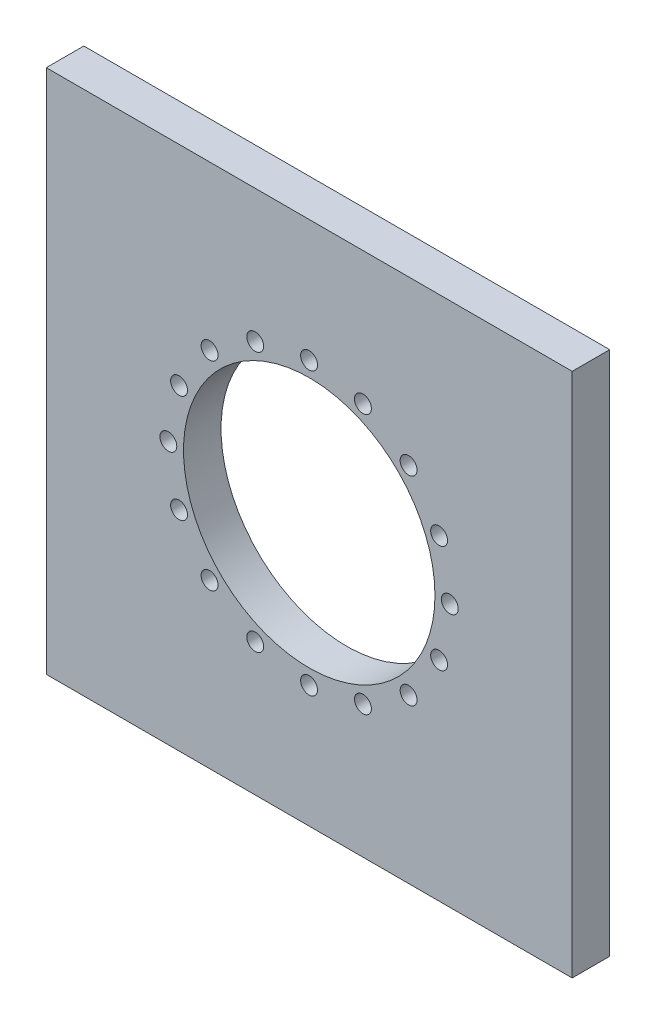
ISO-10303-21;
HEADER;
FILE_DESCRIPTION(('STEP AP214'),'2;1');
FILE_NAME('part.step','',(''),(''),'','','');
FILE_SCHEMA(('AUTOMOTIVE_DESIGN { 1 0 10303 214 1 1 1 1 }'));
ENDSEC;
DATA;
#1=APPLICATION_CONTEXT('core data for automotive mechanical design processes');
#2=APPLICATION_PROTOCOL_DEFINITION('international standard','automotive_design',2000,#1);
#3=PRODUCT_CONTEXT('',#1,'mechanical');
#4=PRODUCT('Part','Part','',(#3));
#5=PRODUCT_RELATED_PRODUCT_CATEGORY('part','',(#4));
#6=PRODUCT_DEFINITION_FORMATION('','',#4);
#7=PRODUCT_DEFINITION_CONTEXT('part definition',#1,'design');
#8=PRODUCT_DEFINITION('design','',#6,#7);
#9=PRODUCT_DEFINITION_SHAPE('','',#8);
#10=(LENGTH_UNIT() NAMED_UNIT(*) SI_UNIT(.MILLI.,.METRE.));
#11=(NAMED_UNIT(*) PLANE_ANGLE_UNIT() SI_UNIT($,.RADIAN.));
#12=(NAMED_UNIT(*) SI_UNIT($,.STERADIAN.) SOLID_ANGLE_UNIT());
#13=UNCERTAINTY_MEASURE_WITH_UNIT(LENGTH_MEASURE(1.E-05),#10,'distance_accuracy_value','');
#14=(GEOMETRIC_REPRESENTATION_CONTEXT(3) GLOBAL_UNCERTAINTY_ASSIGNED_CONTEXT((#13)) GLOBAL_UNIT_ASSIGNED_CONTEXT((#10,
#11,#12)) REPRESENTATION_CONTEXT('',''));
#15=CARTESIAN_POINT('',(0.,0.,0.));
#16=DIRECTION('',(0.,0.,1.));
#17=DIRECTION('',(1.,0.,0.));
#18=AXIS2_PLACEMENT_3D('',#15,#16,#17);
#19=CARTESIAN_POINT('',(-191.921565510779,-70.,10.));
#20=DIRECTION('',(-1.,0.,0.));
#21=DIRECTION('',(0.,0.,1.));
#22=AXIS2_PLACEMENT_3D('',#19,#20,#21);
#23=PLANE('',#22);
#24=DIRECTION('',(0.,1.,0.));
#25=VECTOR('',#24,1.);
#26=CARTESIAN_POINT('',(-191.921565510779,-70.,0.));
#27=LINE('',#26,#25);
#28=CARTESIAN_POINT('',(-191.921565510779,-70.,0.));
#29=VERTEX_POINT('',#28);
#30=CARTESIAN_POINT('',(-191.921565510779,70.,0.));
#31=VERTEX_POINT('',#30);
#32=EDGE_CURVE('E118',#29,#31,#27,.T.);
#33=ORIENTED_EDGE('',*,*,#32,.F.);
#34=DIRECTION('',(0.,0.,-1.));
#35=VECTOR('',#34,1.);
#36=CARTESIAN_POINT('',(-191.921565510779,-70.,10.));
#37=LINE('',#36,#35);
#38=CARTESIAN_POINT('',(-191.921565510779,-70.,10.));
#39=VERTEX_POINT('',#38);
#40=EDGE_CURVE('E12',#39,#29,#37,.T.);
#41=ORIENTED_EDGE('',*,*,#40,.F.);
#42=DIRECTION('',(0.,1.,0.));
#43=VECTOR('',#42,1.);
#44=CARTESIAN_POINT('',(-191.921565510779,-70.,10.));
#45=LINE('',#44,#43);
#46=CARTESIAN_POINT('',(-191.921565510779,70.,10.));
#47=VERTEX_POINT('',#46);
#48=EDGE_CURVE('E110',#39,#47,#45,.T.);
#49=ORIENTED_EDGE('',*,*,#48,.T.);
#50=DIRECTION('',(0.,0.,-1.));
#51=VECTOR('',#50,1.);
#52=CARTESIAN_POINT('',(-191.921565510779,70.,10.));
#53=LINE('',#52,#51);
#54=EDGE_CURVE('E49',#47,#31,#53,.T.);
#55=ORIENTED_EDGE('',*,*,#54,.T.);
#56=EDGE_LOOP('',(#33,#41,#49,#55));
#57=FACE_BOUND('',#56,.T.);
#58=ADVANCED_FACE('F46',(#57),#23,.T.);
#59=CARTESIAN_POINT('',(-191.921565510779,-70.,10.));
#60=DIRECTION('',(0.,1.,0.));
#61=DIRECTION('',(0.,0.,1.));
#62=AXIS2_PLACEMENT_3D('',#59,#60,#61);
#63=PLANE('',#62);
#64=DIRECTION('',(1.,0.,0.));
#65=VECTOR('',#64,1.);
#66=CARTESIAN_POINT('',(-191.921565510779,-70.,0.));
#67=LINE('',#66,#65);
#68=CARTESIAN_POINT('',(-51.7905653631904,-70.,0.));
#69=VERTEX_POINT('',#68);
#70=EDGE_CURVE('E80',#29,#69,#67,.T.);
#71=ORIENTED_EDGE('',*,*,#70,.T.);
#72=DIRECTION('',(0.,0.,-1.));
#73=VECTOR('',#72,1.);
#74=CARTESIAN_POINT('',(-51.7905653631904,-70.,10.));
#75=LINE('',#74,#73);
#76=CARTESIAN_POINT('',(-51.7905653631904,-70.,10.));
#77=VERTEX_POINT('',#76);
#78=EDGE_CURVE('E56',#77,#69,#75,.T.);
#79=ORIENTED_EDGE('',*,*,#78,.F.);
#80=DIRECTION('',(1.,0.,0.));
#81=VECTOR('',#80,1.);
#82=CARTESIAN_POINT('',(-191.921565510779,-70.,10.));
#83=LINE('',#82,#81);
#84=EDGE_CURVE('E97',#39,#77,#83,.T.);
#85=ORIENTED_EDGE('',*,*,#84,.F.);
#86=ORIENTED_EDGE('',*,*,#40,.T.);
#87=EDGE_LOOP('',(#71,#79,#85,#86));
#88=FACE_BOUND('',#87,.T.);
#89=ADVANCED_FACE('F135',(#88),#63,.F.);
#90=CARTESIAN_POINT('',(-51.7905653631904,-70.,10.));
#91=DIRECTION('',(-1.,0.,0.));
#92=DIRECTION('',(0.,0.,1.));
#93=AXIS2_PLACEMENT_3D('',#90,#91,#92);
#94=PLANE('',#93);
#95=DIRECTION('',(0.,1.,0.));
#96=VECTOR('',#95,1.);
#97=CARTESIAN_POINT('',(-51.7905653631904,-70.,0.));
#98=LINE('',#97,#96);
#99=CARTESIAN_POINT('',(-51.7905653631904,70.,0.));
#100=VERTEX_POINT('',#99);
#101=EDGE_CURVE('E105',#69,#100,#98,.T.);
#102=ORIENTED_EDGE('',*,*,#101,.T.);
#103=DIRECTION('',(0.,0.,-1.));
#104=VECTOR('',#103,1.);
#105=CARTESIAN_POINT('',(-51.7905653631904,70.,10.));
#106=LINE('',#105,#104);
#107=CARTESIAN_POINT('',(-51.7905653631904,70.,10.));
#108=VERTEX_POINT('',#107);
#109=EDGE_CURVE('E102',#108,#100,#106,.T.);
#110=ORIENTED_EDGE('',*,*,#109,.F.);
#111=DIRECTION('',(0.,1.,0.));
#112=VECTOR('',#111,1.);
#113=CARTESIAN_POINT('',(-51.7905653631904,-70.,10.));
#114=LINE('',#113,#112);
#115=EDGE_CURVE('E92',#77,#108,#114,.T.);
#116=ORIENTED_EDGE('',*,*,#115,.F.);
#117=ORIENTED_EDGE('',*,*,#78,.T.);
#118=EDGE_LOOP('',(#102,#110,#116,#117));
#119=FACE_BOUND('',#118,.T.);
#120=ADVANCED_FACE('F103',(#119),#94,.F.);
#121=CARTESIAN_POINT('',(-191.921565510779,70.,10.));
#122=DIRECTION('',(0.,1.,0.));
#123=DIRECTION('',(0.,0.,1.));
#124=AXIS2_PLACEMENT_3D('',#121,#122,#123);
#125=PLANE('',#124);
#126=DIRECTION('',(1.,0.,0.));
#127=VECTOR('',#126,1.);
#128=CARTESIAN_POINT('',(-191.921565510779,70.,0.));
#129=LINE('',#128,#127);
#130=EDGE_CURVE('E122',#31,#100,#129,.T.);
#131=ORIENTED_EDGE('',*,*,#130,.F.);
#132=ORIENTED_EDGE('',*,*,#54,.F.);
#133=DIRECTION('',(1.,0.,0.));
#134=VECTOR('',#133,1.);
#135=CARTESIAN_POINT('',(-191.921565510779,70.,10.));
#136=LINE('',#135,#134);
#137=EDGE_CURVE('E96',#47,#108,#136,.T.);
#138=ORIENTED_EDGE('',*,*,#137,.T.);
#139=ORIENTED_EDGE('',*,*,#109,.T.);
#140=EDGE_LOOP('',(#131,#132,#138,#139));
#141=FACE_BOUND('',#140,.T.);
#142=ADVANCED_FACE('F108',(#141),#125,.T.);
#143=CARTESIAN_POINT('',(0.,0.,10.));
#144=DIRECTION('',(0.,0.,-1.));
#145=DIRECTION('',(-1.,0.,0.));
#146=AXIS2_PLACEMENT_3D('',#143,#144,#145);
#147=PLANE('',#146);
#148=CARTESIAN_POINT('',(-95.3827887099841,26.5165042944958,10.));
#149=DIRECTION('',(0.,0.,1.));
#150=DIRECTION('',(1.,0.,0.));
#151=AXIS2_PLACEMENT_3D('',#148,#149,#150);
#152=CIRCLE('',#151,2.25000000000006);
#153=CARTESIAN_POINT('',(-93.132788709984,26.5165042944958,10.));
#154=VERTEX_POINT('',#153);
#155=EDGE_CURVE('E298',#154,#154,#152,.T.);
#156=ORIENTED_EDGE('',*,*,#155,.F.);
#157=EDGE_LOOP('',(#156));
#158=FACE_BOUND('',#157,.T.);
#159=CARTESIAN_POINT('',(-87.2538105353063,14.3506287136913,10.));
#160=DIRECTION('',(0.,0.,1.));
#161=DIRECTION('',(1.,0.,0.));
#162=AXIS2_PLACEMENT_3D('',#159,#160,#161);
#163=CIRCLE('',#162,2.25000000000002);
#164=CARTESIAN_POINT('',(-85.0038105353063,14.3506287136913,10.));
#165=VERTEX_POINT('',#164);
#166=EDGE_CURVE('E306',#165,#165,#163,.T.);
#167=ORIENTED_EDGE('',*,*,#166,.F.);
#168=EDGE_LOOP('',(#167));
#169=FACE_BOUND('',#168,.T.);
#170=CARTESIAN_POINT('',(-84.3992930044792,0.,10.));
#171=DIRECTION('',(0.,0.,1.));
#172=DIRECTION('',(1.,0.,0.));
#173=AXIS2_PLACEMENT_3D('',#170,#171,#172);
#174=CIRCLE('',#173,2.25);
#175=CARTESIAN_POINT('',(-82.1492930044792,0.,10.));
#176=VERTEX_POINT('',#175);
#177=EDGE_CURVE('E314',#176,#176,#174,.T.);
#178=ORIENTED_EDGE('',*,*,#177,.F.);
#179=EDGE_LOOP('',(#178));
#180=FACE_BOUND('',#179,.T.);
#181=CARTESIAN_POINT('',(-87.2538105353063,-14.3506287136901,10.));
#182=DIRECTION('',(0.,0.,1.));
#183=DIRECTION('',(1.,0.,0.));
#184=AXIS2_PLACEMENT_3D('',#181,#182,#183);
#185=CIRCLE('',#184,2.24999999999997);
#186=CARTESIAN_POINT('',(-85.0038105353064,-14.3506287136901,10.));
#187=VERTEX_POINT('',#186);
#188=EDGE_CURVE('E322',#187,#187,#185,.T.);
#189=ORIENTED_EDGE('',*,*,#188,.F.);
#190=EDGE_LOOP('',(#189));
#191=FACE_BOUND('',#190,.T.);
#192=CARTESIAN_POINT('',(-95.3827887099839,-26.5165042944946,10.));
#193=DIRECTION('',(0.,0.,1.));
#194=DIRECTION('',(1.,0.,0.));
#195=AXIS2_PLACEMENT_3D('',#192,#193,#194);
#196=CIRCLE('',#195,2.24999999999996);
#197=CARTESIAN_POINT('',(-93.132788709984,-26.5165042944946,10.));
#198=VERTEX_POINT('',#197);
#199=EDGE_CURVE('E330',#198,#198,#196,.T.);
#200=ORIENTED_EDGE('',*,*,#199,.F.);
#201=EDGE_LOOP('',(#200));
#202=FACE_BOUND('',#201,.T.);
#203=CARTESIAN_POINT('',(-107.548664290788,-34.6454824691723,10.));
#204=DIRECTION('',(0.,0.,1.));
#205=DIRECTION('',(1.,0.,0.));
#206=AXIS2_PLACEMENT_3D('',#203,#204,#205);
#207=CIRCLE('',#206,2.24999999999989);
#208=CARTESIAN_POINT('',(-105.298664290789,-34.6454824691723,10.));
#209=VERTEX_POINT('',#208);
#210=EDGE_CURVE('E338',#209,#209,#207,.T.);
#211=ORIENTED_EDGE('',*,*,#210,.F.);
#212=EDGE_LOOP('',(#211));
#213=FACE_BOUND('',#212,.T.);
#214=CARTESIAN_POINT('',(-121.899293004479,-37.4999999999989,10.));
#215=DIRECTION('',(0.,0.,1.));
#216=DIRECTION('',(1.,0.,0.));
#217=AXIS2_PLACEMENT_3D('',#214,#215,#216);
#218=CIRCLE('',#217,2.25);
#219=CARTESIAN_POINT('',(-119.649293004479,-37.4999999999989,10.));
#220=VERTEX_POINT('',#219);
#221=EDGE_CURVE('E346',#220,#220,#218,.T.);
#222=ORIENTED_EDGE('',*,*,#221,.F.);
#223=EDGE_LOOP('',(#222));
#224=FACE_BOUND('',#223,.T.);
#225=CARTESIAN_POINT('',(-136.24992171817,-34.6454824691723,10.));
#226=DIRECTION('',(0.,0.,1.));
#227=DIRECTION('',(1.,0.,0.));
#228=AXIS2_PLACEMENT_3D('',#225,#226,#227);
#229=CIRCLE('',#228,2.25000000000003);
#230=CARTESIAN_POINT('',(-133.99992171817,-34.6454824691723,10.));
#231=VERTEX_POINT('',#230);
#232=EDGE_CURVE('E236',#231,#231,#229,.T.);
#233=ORIENTED_EDGE('',*,*,#232,.F.);
#234=EDGE_LOOP('',(#233));
#235=FACE_BOUND('',#234,.T.);
#236=CARTESIAN_POINT('',(-148.415797298974,-26.5165042944946,10.));
#237=DIRECTION('',(0.,0.,1.));
#238=DIRECTION('',(1.,0.,0.));
#239=AXIS2_PLACEMENT_3D('',#236,#237,#238);
#240=CIRCLE('',#239,2.25000000000003);
#241=CARTESIAN_POINT('',(-146.165797298974,-26.5165042944946,10.));
#242=VERTEX_POINT('',#241);
#243=EDGE_CURVE('E230',#242,#242,#240,.T.);
#244=ORIENTED_EDGE('',*,*,#243,.F.);
#245=EDGE_LOOP('',(#244));
#246=FACE_BOUND('',#245,.T.);
#247=CARTESIAN_POINT('',(-156.544775473652,-14.3506287136901,10.));
#248=DIRECTION('',(0.,0.,1.));
#249=DIRECTION('',(1.,0.,0.));
#250=AXIS2_PLACEMENT_3D('',#247,#248,#249);
#251=CIRCLE('',#250,2.25000000000003);
#252=CARTESIAN_POINT('',(-154.294775473652,-14.3506287136901,10.));
#253=VERTEX_POINT('',#252);
#254=EDGE_CURVE('E249',#253,#253,#251,.T.);
#255=ORIENTED_EDGE('',*,*,#254,.F.);
#256=EDGE_LOOP('',(#255));
#257=FACE_BOUND('',#256,.T.);
#258=CARTESIAN_POINT('',(-159.399293004478,5.969E-13,10.));
#259=DIRECTION('',(0.,0.,1.));
#260=DIRECTION('',(1.,0.,0.));
#261=AXIS2_PLACEMENT_3D('',#258,#259,#260);
#262=CIRCLE('',#261,2.25);
#263=CARTESIAN_POINT('',(-157.149293004478,5.969E-13,10.));
#264=VERTEX_POINT('',#263);
#265=EDGE_CURVE('E257',#264,#264,#262,.T.);
#266=ORIENTED_EDGE('',*,*,#265,.F.);
#267=EDGE_LOOP('',(#266));
#268=FACE_BOUND('',#267,.T.);
#269=CARTESIAN_POINT('',(-156.544775473652,14.3506287136912,10.));
#270=DIRECTION('',(0.,0.,1.));
#271=DIRECTION('',(1.,0.,0.));
#272=AXIS2_PLACEMENT_3D('',#269,#270,#271);
#273=CIRCLE('',#272,2.25000000000003);
#274=CARTESIAN_POINT('',(-154.294775473652,14.3506287136912,10.));
#275=VERTEX_POINT('',#274);
#276=EDGE_CURVE('E265',#275,#275,#273,.T.);
#277=ORIENTED_EDGE('',*,*,#276,.F.);
#278=EDGE_LOOP('',(#277));
#279=FACE_BOUND('',#278,.T.);
#280=CARTESIAN_POINT('',(-148.415797298974,26.5165042944957,10.));
#281=DIRECTION('',(0.,0.,1.));
#282=DIRECTION('',(1.,0.,0.));
#283=AXIS2_PLACEMENT_3D('',#280,#281,#282);
#284=CIRCLE('',#283,2.24999999999995);
#285=CARTESIAN_POINT('',(-146.165797298974,26.5165042944957,10.));
#286=VERTEX_POINT('',#285);
#287=EDGE_CURVE('E273',#286,#286,#284,.T.);
#288=ORIENTED_EDGE('',*,*,#287,.F.);
#289=EDGE_LOOP('',(#288));
#290=FACE_BOUND('',#289,.T.);
#291=CARTESIAN_POINT('',(-136.24992171817,34.6454824691734,10.));
#292=DIRECTION('',(0.,0.,1.));
#293=DIRECTION('',(1.,0.,0.));
#294=AXIS2_PLACEMENT_3D('',#291,#292,#293);
#295=CIRCLE('',#294,2.25);
#296=CARTESIAN_POINT('',(-133.99992171817,34.6454824691734,10.));
#297=VERTEX_POINT('',#296);
#298=EDGE_CURVE('E281',#297,#297,#295,.T.);
#299=ORIENTED_EDGE('',*,*,#298,.F.);
#300=EDGE_LOOP('',(#299));
#301=FACE_BOUND('',#300,.T.);
#302=CARTESIAN_POINT('',(-121.899293004479,37.5,10.));
#303=DIRECTION('',(0.,0.,1.));
#304=DIRECTION('',(1.,0.,0.));
#305=AXIS2_PLACEMENT_3D('',#302,#303,#304);
#306=CIRCLE('',#305,2.25);
#307=CARTESIAN_POINT('',(-119.649293004479,37.5,10.));
#308=VERTEX_POINT('',#307);
#309=EDGE_CURVE('E289',#308,#308,#306,.T.);
#310=ORIENTED_EDGE('',*,*,#309,.F.);
#311=EDGE_LOOP('',(#310));
#312=FACE_BOUND('',#311,.T.);
#313=CARTESIAN_POINT('',(-107.548664290788,34.6454824691734,10.));
#314=DIRECTION('',(0.,0.,1.));
#315=DIRECTION('',(1.,0.,0.));
#316=AXIS2_PLACEMENT_3D('',#313,#314,#315);
#317=CIRCLE('',#316,2.25000000000007);
#318=CARTESIAN_POINT('',(-105.298664290788,34.6454824691734,10.));
#319=VERTEX_POINT('',#318);
#320=EDGE_CURVE('E353',#319,#319,#317,.T.);
#321=ORIENTED_EDGE('',*,*,#320,.F.);
#322=EDGE_LOOP('',(#321));
#323=FACE_BOUND('',#322,.T.);
#324=CARTESIAN_POINT('',(-121.856065436985,0.,10.));
#325=DIRECTION('',(0.,0.,1.));
#326=DIRECTION('',(1.,0.,0.));
#327=AXIS2_PLACEMENT_3D('',#324,#325,#326);
#328=CIRCLE('',#327,33.4999994968227);
#329=CARTESIAN_POINT('',(-88.356065940162,0.,10.));
#330=VERTEX_POINT('',#329);
#331=EDGE_CURVE('E123',#330,#330,#328,.T.);
#332=ORIENTED_EDGE('',*,*,#331,.F.);
#333=EDGE_LOOP('',(#332));
#334=FACE_BOUND('',#333,.T.);
#335=ORIENTED_EDGE('',*,*,#48,.F.);
#336=ORIENTED_EDGE('',*,*,#84,.T.);
#337=ORIENTED_EDGE('',*,*,#115,.T.);
#338=ORIENTED_EDGE('',*,*,#137,.F.);
#339=EDGE_LOOP('',(#335,#336,#337,#338));
#340=FACE_BOUND('',#339,.T.);
#341=ADVANCED_FACE('F95',(#158,#169,#180,#191,#202,#213,#224,#235,#246,#257,#268,#279,#290,#301,
#312,#323,#334,#340),#147,.F.);
#342=CARTESIAN_POINT('',(0.,0.,0.));
#343=DIRECTION('',(0.,0.,-1.));
#344=DIRECTION('',(-1.,0.,0.));
#345=AXIS2_PLACEMENT_3D('',#342,#343,#344);
#346=PLANE('',#345);
#347=CARTESIAN_POINT('',(-95.3827887099841,26.5165042944958,0.));
#348=DIRECTION('',(0.,0.,1.));
#349=DIRECTION('',(1.,0.,0.));
#350=AXIS2_PLACEMENT_3D('',#347,#348,#349);
#351=CIRCLE('',#350,2.25000000000006);
#352=CARTESIAN_POINT('',(-93.132788709984,26.5165042944958,0.));
#353=VERTEX_POINT('',#352);
#354=EDGE_CURVE('E293',#353,#353,#351,.T.);
#355=ORIENTED_EDGE('',*,*,#354,.T.);
#356=EDGE_LOOP('',(#355));
#357=FACE_BOUND('',#356,.T.);
#358=CARTESIAN_POINT('',(-87.2538105353063,14.3506287136913,0.));
#359=DIRECTION('',(0.,0.,1.));
#360=DIRECTION('',(1.,0.,0.));
#361=AXIS2_PLACEMENT_3D('',#358,#359,#360);
#362=CIRCLE('',#361,2.25000000000002);
#363=CARTESIAN_POINT('',(-85.0038105353063,14.3506287136913,0.));
#364=VERTEX_POINT('',#363);
#365=EDGE_CURVE('E302',#364,#364,#362,.T.);
#366=ORIENTED_EDGE('',*,*,#365,.T.);
#367=EDGE_LOOP('',(#366));
#368=FACE_BOUND('',#367,.T.);
#369=CARTESIAN_POINT('',(-84.3992930044792,0.,0.));
#370=DIRECTION('',(0.,0.,1.));
#371=DIRECTION('',(1.,0.,0.));
#372=AXIS2_PLACEMENT_3D('',#369,#370,#371);
#373=CIRCLE('',#372,2.25);
#374=CARTESIAN_POINT('',(-82.1492930044792,0.,0.));
#375=VERTEX_POINT('',#374);
#376=EDGE_CURVE('E310',#375,#375,#373,.T.);
#377=ORIENTED_EDGE('',*,*,#376,.T.);
#378=EDGE_LOOP('',(#377));
#379=FACE_BOUND('',#378,.T.);
#380=CARTESIAN_POINT('',(-87.2538105353063,-14.3506287136901,0.));
#381=DIRECTION('',(0.,0.,1.));
#382=DIRECTION('',(1.,0.,0.));
#383=AXIS2_PLACEMENT_3D('',#380,#381,#382);
#384=CIRCLE('',#383,2.24999999999997);
#385=CARTESIAN_POINT('',(-85.0038105353064,-14.3506287136901,0.));
#386=VERTEX_POINT('',#385);
#387=EDGE_CURVE('E318',#386,#386,#384,.T.);
#388=ORIENTED_EDGE('',*,*,#387,.T.);
#389=EDGE_LOOP('',(#388));
#390=FACE_BOUND('',#389,.T.);
#391=CARTESIAN_POINT('',(-95.3827887099839,-26.5165042944946,0.));
#392=DIRECTION('',(0.,0.,1.));
#393=DIRECTION('',(1.,0.,0.));
#394=AXIS2_PLACEMENT_3D('',#391,#392,#393);
#395=CIRCLE('',#394,2.24999999999996);
#396=CARTESIAN_POINT('',(-93.132788709984,-26.5165042944946,0.));
#397=VERTEX_POINT('',#396);
#398=EDGE_CURVE('E326',#397,#397,#395,.T.);
#399=ORIENTED_EDGE('',*,*,#398,.T.);
#400=EDGE_LOOP('',(#399));
#401=FACE_BOUND('',#400,.T.);
#402=CARTESIAN_POINT('',(-107.548664290788,-34.6454824691723,0.));
#403=DIRECTION('',(0.,0.,1.));
#404=DIRECTION('',(1.,0.,0.));
#405=AXIS2_PLACEMENT_3D('',#402,#403,#404);
#406=CIRCLE('',#405,2.24999999999989);
#407=CARTESIAN_POINT('',(-105.298664290789,-34.6454824691723,0.));
#408=VERTEX_POINT('',#407);
#409=EDGE_CURVE('E334',#408,#408,#406,.T.);
#410=ORIENTED_EDGE('',*,*,#409,.T.);
#411=EDGE_LOOP('',(#410));
#412=FACE_BOUND('',#411,.T.);
#413=CARTESIAN_POINT('',(-121.899293004479,-37.4999999999989,0.));
#414=DIRECTION('',(0.,0.,1.));
#415=DIRECTION('',(1.,0.,0.));
#416=AXIS2_PLACEMENT_3D('',#413,#414,#415);
#417=CIRCLE('',#416,2.25);
#418=CARTESIAN_POINT('',(-119.649293004479,-37.4999999999989,0.));
#419=VERTEX_POINT('',#418);
#420=EDGE_CURVE('E342',#419,#419,#417,.T.);
#421=ORIENTED_EDGE('',*,*,#420,.T.);
#422=EDGE_LOOP('',(#421));
#423=FACE_BOUND('',#422,.T.);
#424=CARTESIAN_POINT('',(-136.24992171817,-34.6454824691723,0.));
#425=DIRECTION('',(0.,0.,1.));
#426=DIRECTION('',(1.,0.,0.));
#427=AXIS2_PLACEMENT_3D('',#424,#425,#426);
#428=CIRCLE('',#427,2.25000000000003);
#429=CARTESIAN_POINT('',(-133.99992171817,-34.6454824691723,0.));
#430=VERTEX_POINT('',#429);
#431=EDGE_CURVE('E241',#430,#430,#428,.T.);
#432=ORIENTED_EDGE('',*,*,#431,.T.);
#433=EDGE_LOOP('',(#432));
#434=FACE_BOUND('',#433,.T.);
#435=CARTESIAN_POINT('',(-148.415797298974,-26.5165042944946,0.));
#436=DIRECTION('',(0.,0.,1.));
#437=DIRECTION('',(1.,0.,0.));
#438=AXIS2_PLACEMENT_3D('',#435,#436,#437);
#439=CIRCLE('',#438,2.25000000000003);
#440=CARTESIAN_POINT('',(-146.165797298974,-26.5165042944946,0.));
#441=VERTEX_POINT('',#440);
#442=EDGE_CURVE('E233',#441,#441,#439,.T.);
#443=ORIENTED_EDGE('',*,*,#442,.T.);
#444=EDGE_LOOP('',(#443));
#445=FACE_BOUND('',#444,.T.);
#446=CARTESIAN_POINT('',(-156.544775473652,-14.3506287136901,0.));
#447=DIRECTION('',(0.,0.,1.));
#448=DIRECTION('',(1.,0.,0.));
#449=AXIS2_PLACEMENT_3D('',#446,#447,#448);
#450=CIRCLE('',#449,2.25000000000003);
#451=CARTESIAN_POINT('',(-154.294775473652,-14.3506287136901,0.));
#452=VERTEX_POINT('',#451);
#453=EDGE_CURVE('E243',#452,#452,#450,.T.);
#454=ORIENTED_EDGE('',*,*,#453,.T.);
#455=EDGE_LOOP('',(#454));
#456=FACE_BOUND('',#455,.T.);
#457=CARTESIAN_POINT('',(-159.399293004478,5.969E-13,0.));
#458=DIRECTION('',(0.,0.,1.));
#459=DIRECTION('',(1.,0.,0.));
#460=AXIS2_PLACEMENT_3D('',#457,#458,#459);
#461=CIRCLE('',#460,2.25);
#462=CARTESIAN_POINT('',(-157.149293004478,5.969E-13,0.));
#463=VERTEX_POINT('',#462);
#464=EDGE_CURVE('E253',#463,#463,#461,.T.);
#465=ORIENTED_EDGE('',*,*,#464,.T.);
#466=EDGE_LOOP('',(#465));
#467=FACE_BOUND('',#466,.T.);
#468=CARTESIAN_POINT('',(-156.544775473652,14.3506287136912,0.));
#469=DIRECTION('',(0.,0.,1.));
#470=DIRECTION('',(1.,0.,0.));
#471=AXIS2_PLACEMENT_3D('',#468,#469,#470);
#472=CIRCLE('',#471,2.25000000000003);
#473=CARTESIAN_POINT('',(-154.294775473652,14.3506287136912,0.));
#474=VERTEX_POINT('',#473);
#475=EDGE_CURVE('E261',#474,#474,#472,.T.);
#476=ORIENTED_EDGE('',*,*,#475,.T.);
#477=EDGE_LOOP('',(#476));
#478=FACE_BOUND('',#477,.T.);
#479=CARTESIAN_POINT('',(-148.415797298974,26.5165042944957,0.));
#480=DIRECTION('',(0.,0.,1.));
#481=DIRECTION('',(1.,0.,0.));
#482=AXIS2_PLACEMENT_3D('',#479,#480,#481);
#483=CIRCLE('',#482,2.24999999999995);
#484=CARTESIAN_POINT('',(-146.165797298974,26.5165042944957,0.));
#485=VERTEX_POINT('',#484);
#486=EDGE_CURVE('E269',#485,#485,#483,.T.);
#487=ORIENTED_EDGE('',*,*,#486,.T.);
#488=EDGE_LOOP('',(#487));
#489=FACE_BOUND('',#488,.T.);
#490=CARTESIAN_POINT('',(-136.24992171817,34.6454824691734,0.));
#491=DIRECTION('',(0.,0.,1.));
#492=DIRECTION('',(1.,0.,0.));
#493=AXIS2_PLACEMENT_3D('',#490,#491,#492);
#494=CIRCLE('',#493,2.25);
#495=CARTESIAN_POINT('',(-133.99992171817,34.6454824691734,0.));
#496=VERTEX_POINT('',#495);
#497=EDGE_CURVE('E277',#496,#496,#494,.T.);
#498=ORIENTED_EDGE('',*,*,#497,.T.);
#499=EDGE_LOOP('',(#498));
#500=FACE_BOUND('',#499,.T.);
#501=CARTESIAN_POINT('',(-121.899293004479,37.5,0.));
#502=DIRECTION('',(0.,0.,1.));
#503=DIRECTION('',(1.,0.,0.));
#504=AXIS2_PLACEMENT_3D('',#501,#502,#503);
#505=CIRCLE('',#504,2.25);
#506=CARTESIAN_POINT('',(-119.649293004479,37.5,0.));
#507=VERTEX_POINT('',#506);
#508=EDGE_CURVE('E285',#507,#507,#505,.T.);
#509=ORIENTED_EDGE('',*,*,#508,.T.);
#510=EDGE_LOOP('',(#509));
#511=FACE_BOUND('',#510,.T.);
#512=CARTESIAN_POINT('',(-107.548664290788,34.6454824691734,0.));
#513=DIRECTION('',(0.,0.,1.));
#514=DIRECTION('',(1.,0.,0.));
#515=AXIS2_PLACEMENT_3D('',#512,#513,#514);
#516=CIRCLE('',#515,2.25000000000007);
#517=CARTESIAN_POINT('',(-105.298664290788,34.6454824691734,0.));
#518=VERTEX_POINT('',#517);
#519=EDGE_CURVE('E297',#518,#518,#516,.T.);
#520=ORIENTED_EDGE('',*,*,#519,.T.);
#521=EDGE_LOOP('',(#520));
#522=FACE_BOUND('',#521,.T.);
#523=CARTESIAN_POINT('',(-121.856065436985,0.,0.));
#524=DIRECTION('',(0.,0.,1.));
#525=DIRECTION('',(1.,0.,0.));
#526=AXIS2_PLACEMENT_3D('',#523,#524,#525);
#527=CIRCLE('',#526,33.4999994968227);
#528=CARTESIAN_POINT('',(-88.356065940162,0.,0.));
#529=VERTEX_POINT('',#528);
#530=EDGE_CURVE('E357',#529,#529,#527,.T.);
#531=ORIENTED_EDGE('',*,*,#530,.T.);
#532=EDGE_LOOP('',(#531));
#533=FACE_BOUND('',#532,.T.);
#534=ORIENTED_EDGE('',*,*,#32,.T.);
#535=ORIENTED_EDGE('',*,*,#130,.T.);
#536=ORIENTED_EDGE('',*,*,#101,.F.);
#537=ORIENTED_EDGE('',*,*,#70,.F.);
#538=EDGE_LOOP('',(#534,#535,#536,#537));
#539=FACE_BOUND('',#538,.T.);
#540=ADVANCED_FACE('F132',(#357,#368,#379,#390,#401,#412,#423,#434,#445,#456,#467,#478,#489,
#500,#511,#522,#533,#539),#346,.T.);
#541=CARTESIAN_POINT('',(-121.856065436985,0.,10.));
#542=DIRECTION('',(0.,0.,-1.));
#543=DIRECTION('',(-1.,0.,0.));
#544=AXIS2_PLACEMENT_3D('',#541,#542,#543);
#545=CYLINDRICAL_SURFACE('',#544,33.4999994968227);
#546=ORIENTED_EDGE('',*,*,#331,.T.);
#547=EDGE_LOOP('',(#546));
#548=FACE_BOUND('',#547,.T.);
#549=ORIENTED_EDGE('',*,*,#530,.F.);
#550=EDGE_LOOP('',(#549));
#551=FACE_BOUND('',#550,.T.);
#552=ADVANCED_FACE('F155',(#548,#551),#545,.F.);
#553=CARTESIAN_POINT('',(-107.548664290788,34.6454824691734,10.));
#554=DIRECTION('',(0.,0.,-1.));
#555=DIRECTION('',(-1.,0.,0.));
#556=AXIS2_PLACEMENT_3D('',#553,#554,#555);
#557=CYLINDRICAL_SURFACE('',#556,2.25000000000007);
#558=ORIENTED_EDGE('',*,*,#320,.T.);
#559=EDGE_LOOP('',(#558));
#560=FACE_BOUND('',#559,.T.);
#561=ORIENTED_EDGE('',*,*,#519,.F.);
#562=EDGE_LOOP('',(#561));
#563=FACE_BOUND('',#562,.T.);
#564=ADVANCED_FACE('F161',(#560,#563),#557,.F.);
#565=CARTESIAN_POINT('',(-121.899293004479,37.5,10.));
#566=DIRECTION('',(0.,0.,-1.));
#567=DIRECTION('',(-1.,0.,0.));
#568=AXIS2_PLACEMENT_3D('',#565,#566,#567);
#569=CYLINDRICAL_SURFACE('',#568,2.25);
#570=ORIENTED_EDGE('',*,*,#309,.T.);
#571=EDGE_LOOP('',(#570));
#572=FACE_BOUND('',#571,.T.);
#573=ORIENTED_EDGE('',*,*,#508,.F.);
#574=EDGE_LOOP('',(#573));
#575=FACE_BOUND('',#574,.T.);
#576=ADVANCED_FACE('F165',(#572,#575),#569,.F.);
#577=CARTESIAN_POINT('',(-136.24992171817,34.6454824691734,10.));
#578=DIRECTION('',(0.,0.,-1.));
#579=DIRECTION('',(-1.,0.,0.));
#580=AXIS2_PLACEMENT_3D('',#577,#578,#579);
#581=CYLINDRICAL_SURFACE('',#580,2.25);
#582=ORIENTED_EDGE('',*,*,#298,.T.);
#583=EDGE_LOOP('',(#582));
#584=FACE_BOUND('',#583,.T.);
#585=ORIENTED_EDGE('',*,*,#497,.F.);
#586=EDGE_LOOP('',(#585));
#587=FACE_BOUND('',#586,.T.);
#588=ADVANCED_FACE('F202',(#584,#587),#581,.F.);
#589=CARTESIAN_POINT('',(-148.415797298974,26.5165042944957,10.));
#590=DIRECTION('',(0.,0.,-1.));
#591=DIRECTION('',(-1.,0.,0.));
#592=AXIS2_PLACEMENT_3D('',#589,#590,#591);
#593=CYLINDRICAL_SURFACE('',#592,2.24999999999995);
#594=ORIENTED_EDGE('',*,*,#287,.T.);
#595=EDGE_LOOP('',(#594));
#596=FACE_BOUND('',#595,.T.);
#597=ORIENTED_EDGE('',*,*,#486,.F.);
#598=EDGE_LOOP('',(#597));
#599=FACE_BOUND('',#598,.T.);
#600=ADVANCED_FACE('F206',(#596,#599),#593,.F.);
#601=CARTESIAN_POINT('',(-156.544775473652,14.3506287136912,10.));
#602=DIRECTION('',(0.,0.,-1.));
#603=DIRECTION('',(-1.,0.,0.));
#604=AXIS2_PLACEMENT_3D('',#601,#602,#603);
#605=CYLINDRICAL_SURFACE('',#604,2.25000000000003);
#606=ORIENTED_EDGE('',*,*,#276,.T.);
#607=EDGE_LOOP('',(#606));
#608=FACE_BOUND('',#607,.T.);
#609=ORIENTED_EDGE('',*,*,#475,.F.);
#610=EDGE_LOOP('',(#609));
#611=FACE_BOUND('',#610,.T.);
#612=ADVANCED_FACE('F210',(#608,#611),#605,.F.);
#613=CARTESIAN_POINT('',(-159.399293004478,5.969E-13,10.));
#614=DIRECTION('',(0.,0.,-1.));
#615=DIRECTION('',(-1.,0.,0.));
#616=AXIS2_PLACEMENT_3D('',#613,#614,#615);
#617=CYLINDRICAL_SURFACE('',#616,2.25);
#618=ORIENTED_EDGE('',*,*,#265,.T.);
#619=EDGE_LOOP('',(#618));
#620=FACE_BOUND('',#619,.T.);
#621=ORIENTED_EDGE('',*,*,#464,.F.);
#622=EDGE_LOOP('',(#621));
#623=FACE_BOUND('',#622,.T.);
#624=ADVANCED_FACE('F214',(#620,#623),#617,.F.);
#625=CARTESIAN_POINT('',(-156.544775473652,-14.3506287136901,10.));
#626=DIRECTION('',(0.,0.,-1.));
#627=DIRECTION('',(-1.,0.,0.));
#628=AXIS2_PLACEMENT_3D('',#625,#626,#627);
#629=CYLINDRICAL_SURFACE('',#628,2.25000000000003);
#630=ORIENTED_EDGE('',*,*,#254,.T.);
#631=EDGE_LOOP('',(#630));
#632=FACE_BOUND('',#631,.T.);
#633=ORIENTED_EDGE('',*,*,#453,.F.);
#634=EDGE_LOOP('',(#633));
#635=FACE_BOUND('',#634,.T.);
#636=ADVANCED_FACE('F218',(#632,#635),#629,.F.);
#637=CARTESIAN_POINT('',(-148.415797298974,-26.5165042944946,10.));
#638=DIRECTION('',(0.,0.,-1.));
#639=DIRECTION('',(-1.,0.,0.));
#640=AXIS2_PLACEMENT_3D('',#637,#638,#639);
#641=CYLINDRICAL_SURFACE('',#640,2.25000000000003);
#642=ORIENTED_EDGE('',*,*,#243,.T.);
#643=EDGE_LOOP('',(#642));
#644=FACE_BOUND('',#643,.T.);
#645=ORIENTED_EDGE('',*,*,#442,.F.);
#646=EDGE_LOOP('',(#645));
#647=FACE_BOUND('',#646,.T.);
#648=ADVANCED_FACE('F171',(#644,#647),#641,.F.);
#649=CARTESIAN_POINT('',(-136.24992171817,-34.6454824691723,10.));
#650=DIRECTION('',(0.,0.,-1.));
#651=DIRECTION('',(-1.,0.,0.));
#652=AXIS2_PLACEMENT_3D('',#649,#650,#651);
#653=CYLINDRICAL_SURFACE('',#652,2.25000000000003);
#654=ORIENTED_EDGE('',*,*,#232,.T.);
#655=EDGE_LOOP('',(#654));
#656=FACE_BOUND('',#655,.T.);
#657=ORIENTED_EDGE('',*,*,#431,.F.);
#658=EDGE_LOOP('',(#657));
#659=FACE_BOUND('',#658,.T.);
#660=ADVANCED_FACE('F167',(#656,#659),#653,.F.);
#661=CARTESIAN_POINT('',(-121.899293004479,-37.4999999999989,10.));
#662=DIRECTION('',(0.,0.,-1.));
#663=DIRECTION('',(-1.,0.,0.));
#664=AXIS2_PLACEMENT_3D('',#661,#662,#663);
#665=CYLINDRICAL_SURFACE('',#664,2.25);
#666=ORIENTED_EDGE('',*,*,#221,.T.);
#667=EDGE_LOOP('',(#666));
#668=FACE_BOUND('',#667,.T.);
#669=ORIENTED_EDGE('',*,*,#420,.F.);
#670=EDGE_LOOP('',(#669));
#671=FACE_BOUND('',#670,.T.);
#672=ADVANCED_FACE('F170',(#668,#671),#665,.F.);
#673=CARTESIAN_POINT('',(-107.548664290788,-34.6454824691723,10.));
#674=DIRECTION('',(0.,0.,-1.));
#675=DIRECTION('',(-1.,0.,0.));
#676=AXIS2_PLACEMENT_3D('',#673,#674,#675);
#677=CYLINDRICAL_SURFACE('',#676,2.24999999999989);
#678=ORIENTED_EDGE('',*,*,#210,.T.);
#679=EDGE_LOOP('',(#678));
#680=FACE_BOUND('',#679,.T.);
#681=ORIENTED_EDGE('',*,*,#409,.F.);
#682=EDGE_LOOP('',(#681));
#683=FACE_BOUND('',#682,.T.);
#684=ADVANCED_FACE('F175',(#680,#683),#677,.F.);
#685=CARTESIAN_POINT('',(-95.3827887099839,-26.5165042944946,10.));
#686=DIRECTION('',(0.,0.,-1.));
#687=DIRECTION('',(-1.,0.,0.));
#688=AXIS2_PLACEMENT_3D('',#685,#686,#687);
#689=CYLINDRICAL_SURFACE('',#688,2.24999999999996);
#690=ORIENTED_EDGE('',*,*,#199,.T.);
#691=EDGE_LOOP('',(#690));
#692=FACE_BOUND('',#691,.T.);
#693=ORIENTED_EDGE('',*,*,#398,.F.);
#694=EDGE_LOOP('',(#693));
#695=FACE_BOUND('',#694,.T.);
#696=ADVANCED_FACE('F179',(#692,#695),#689,.F.);
#697=CARTESIAN_POINT('',(-87.2538105353063,-14.3506287136901,10.));
#698=DIRECTION('',(0.,0.,-1.));
#699=DIRECTION('',(-1.,0.,0.));
#700=AXIS2_PLACEMENT_3D('',#697,#698,#699);
#701=CYLINDRICAL_SURFACE('',#700,2.24999999999997);
#702=ORIENTED_EDGE('',*,*,#188,.T.);
#703=EDGE_LOOP('',(#702));
#704=FACE_BOUND('',#703,.T.);
#705=ORIENTED_EDGE('',*,*,#387,.F.);
#706=EDGE_LOOP('',(#705));
#707=FACE_BOUND('',#706,.T.);
#708=ADVANCED_FACE('F183',(#704,#707),#701,.F.);
#709=CARTESIAN_POINT('',(-84.3992930044792,0.,10.));
#710=DIRECTION('',(0.,0.,-1.));
#711=DIRECTION('',(-1.,0.,0.));
#712=AXIS2_PLACEMENT_3D('',#709,#710,#711);
#713=CYLINDRICAL_SURFACE('',#712,2.25);
#714=ORIENTED_EDGE('',*,*,#177,.T.);
#715=EDGE_LOOP('',(#714));
#716=FACE_BOUND('',#715,.T.);
#717=ORIENTED_EDGE('',*,*,#376,.F.);
#718=EDGE_LOOP('',(#717));
#719=FACE_BOUND('',#718,.T.);
#720=ADVANCED_FACE('F187',(#716,#719),#713,.F.);
#721=CARTESIAN_POINT('',(-87.2538105353063,14.3506287136913,10.));
#722=DIRECTION('',(0.,0.,-1.));
#723=DIRECTION('',(-1.,0.,0.));
#724=AXIS2_PLACEMENT_3D('',#721,#722,#723);
#725=CYLINDRICAL_SURFACE('',#724,2.25000000000002);
#726=ORIENTED_EDGE('',*,*,#166,.T.);
#727=EDGE_LOOP('',(#726));
#728=FACE_BOUND('',#727,.T.);
#729=ORIENTED_EDGE('',*,*,#365,.F.);
#730=EDGE_LOOP('',(#729));
#731=FACE_BOUND('',#730,.T.);
#732=ADVANCED_FACE('F191',(#728,#731),#725,.F.);
#733=CARTESIAN_POINT('',(-95.3827887099841,26.5165042944958,10.));
#734=DIRECTION('',(0.,0.,-1.));
#735=DIRECTION('',(-1.,0.,0.));
#736=AXIS2_PLACEMENT_3D('',#733,#734,#735);
#737=CYLINDRICAL_SURFACE('',#736,2.25000000000006);
#738=ORIENTED_EDGE('',*,*,#155,.T.);
#739=EDGE_LOOP('',(#738));
#740=FACE_BOUND('',#739,.T.);
#741=ORIENTED_EDGE('',*,*,#354,.F.);
#742=EDGE_LOOP('',(#741));
#743=FACE_BOUND('',#742,.T.);
#744=ADVANCED_FACE('F195',(#740,#743),#737,.F.);
#745=CLOSED_SHELL('',(#58,#89,#120,#142,#341,#540,#552,#564,#576,#588,#600,#612,#624,#636,#648,
#660,#672,#684,#696,#708,#720,#732,#744));
#746=MANIFOLD_SOLID_BREP('B2',#745);
#747=ADVANCED_BREP_SHAPE_REPRESENTATION('',(#18,#746),#14);
#748=SHAPE_DEFINITION_REPRESENTATION(#9,#747);
ENDSEC;
END-ISO-10303-21;
